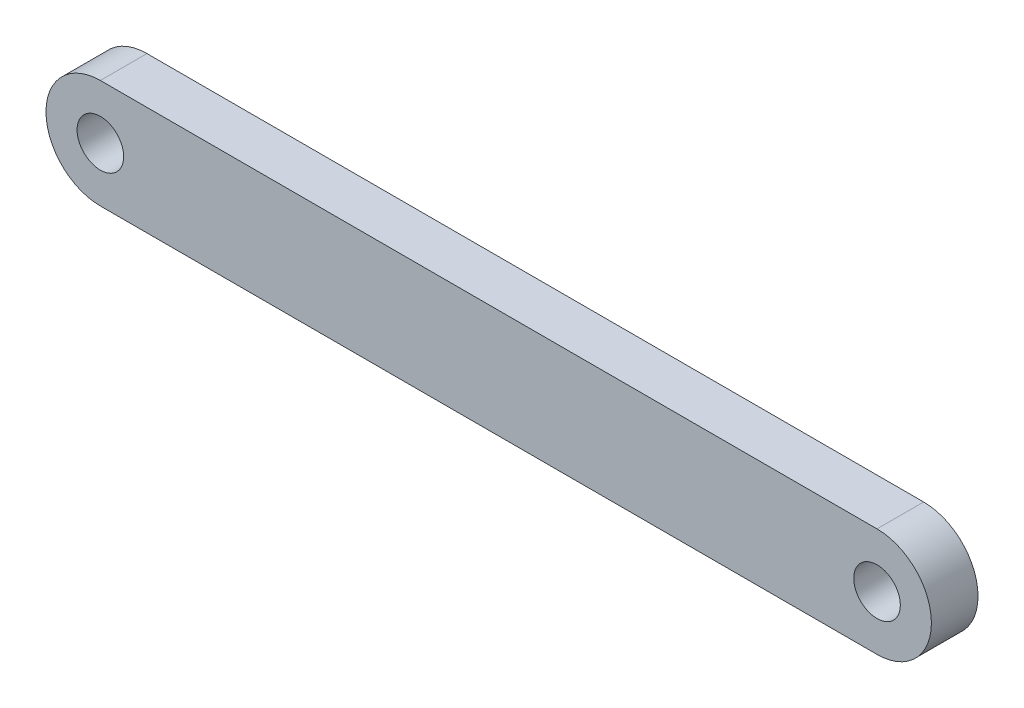
ISO-10303-21;
HEADER;
FILE_DESCRIPTION(('STEP AP214'),'2;1');
FILE_NAME('part.step','',(''),(''),'','','');
FILE_SCHEMA(('AUTOMOTIVE_DESIGN { 1 0 10303 214 1 1 1 1 }'));
ENDSEC;
DATA;
#1=APPLICATION_CONTEXT('core data for automotive mechanical design processes');
#2=APPLICATION_PROTOCOL_DEFINITION('international standard','automotive_design',2000,#1);
#3=PRODUCT_CONTEXT('',#1,'mechanical');
#4=PRODUCT('Part','Part','',(#3));
#5=PRODUCT_RELATED_PRODUCT_CATEGORY('part','',(#4));
#6=PRODUCT_DEFINITION_FORMATION('','',#4);
#7=PRODUCT_DEFINITION_CONTEXT('part definition',#1,'design');
#8=PRODUCT_DEFINITION('design','',#6,#7);
#9=PRODUCT_DEFINITION_SHAPE('','',#8);
#10=(LENGTH_UNIT() NAMED_UNIT(*) SI_UNIT(.MILLI.,.METRE.));
#11=(NAMED_UNIT(*) PLANE_ANGLE_UNIT() SI_UNIT($,.RADIAN.));
#12=(NAMED_UNIT(*) SI_UNIT($,.STERADIAN.) SOLID_ANGLE_UNIT());
#13=UNCERTAINTY_MEASURE_WITH_UNIT(LENGTH_MEASURE(1.E-05),#10,'distance_accuracy_value','');
#14=(GEOMETRIC_REPRESENTATION_CONTEXT(3) GLOBAL_UNCERTAINTY_ASSIGNED_CONTEXT((#13)) GLOBAL_UNIT_ASSIGNED_CONTEXT((#10,
#11,#12)) REPRESENTATION_CONTEXT('',''));
#15=CARTESIAN_POINT('',(0.,0.,0.));
#16=DIRECTION('',(0.,0.,1.));
#17=DIRECTION('',(1.,0.,0.));
#18=AXIS2_PLACEMENT_3D('',#15,#16,#17);
#19=CARTESIAN_POINT('',(50.75,31.9999999999999,3.));
#20=DIRECTION('',(0.,0.,-1.));
#21=DIRECTION('',(-1.,0.,0.));
#22=AXIS2_PLACEMENT_3D('',#19,#20,#21);
#23=PLANE('',#22);
#24=CARTESIAN_POINT('',(50.75,31.9999999999999,3.));
#25=DIRECTION('',(0.,0.,1.));
#26=DIRECTION('',(-1.,0.,0.));
#27=AXIS2_PLACEMENT_3D('',#24,#25,#26);
#28=CIRCLE('',#27,3.5);
#29=CARTESIAN_POINT('',(50.75,28.4999999999999,3.));
#30=VERTEX_POINT('',#29);
#31=CARTESIAN_POINT('',(50.75,35.5,3.));
#32=VERTEX_POINT('',#31);
#33=EDGE_CURVE('E89',#30,#32,#28,.T.);
#34=ORIENTED_EDGE('',*,*,#33,.T.);
#35=DIRECTION('',(-1.,0.,0.));
#36=VECTOR('',#35,1.);
#37=CARTESIAN_POINT('',(50.75,35.5,3.));
#38=LINE('',#37,#36);
#39=CARTESIAN_POINT('',(0.74999999999999,35.4999999999999,3.));
#40=VERTEX_POINT('',#39);
#41=EDGE_CURVE('E84',#32,#40,#38,.T.);
#42=ORIENTED_EDGE('',*,*,#41,.T.);
#43=CARTESIAN_POINT('',(0.749999999999994,31.9999999999999,3.));
#44=DIRECTION('',(0.,0.,1.));
#45=DIRECTION('',(-1.,0.,0.));
#46=AXIS2_PLACEMENT_3D('',#43,#44,#45);
#47=CIRCLE('',#46,3.49999999999999);
#48=CARTESIAN_POINT('',(0.749999999999994,28.5,3.));
#49=VERTEX_POINT('',#48);
#50=EDGE_CURVE('E87',#40,#49,#47,.T.);
#51=ORIENTED_EDGE('',*,*,#50,.T.);
#52=DIRECTION('',(1.,0.,0.));
#53=VECTOR('',#52,1.);
#54=CARTESIAN_POINT('',(50.75,28.4999999999999,3.));
#55=LINE('',#54,#53);
#56=EDGE_CURVE('E54',#49,#30,#55,.T.);
#57=ORIENTED_EDGE('',*,*,#56,.T.);
#58=EDGE_LOOP('',(#34,#42,#51,#57));
#59=FACE_BOUND('',#58,.T.);
#60=CARTESIAN_POINT('',(50.75,31.9999999999999,3.));
#61=DIRECTION('',(0.,0.,1.));
#62=DIRECTION('',(1.,0.,0.));
#63=AXIS2_PLACEMENT_3D('',#60,#61,#62);
#64=CIRCLE('',#63,1.5);
#65=CARTESIAN_POINT('',(52.25,31.9999999999999,3.));
#66=VERTEX_POINT('',#65);
#67=EDGE_CURVE('E104',#66,#66,#64,.T.);
#68=ORIENTED_EDGE('',*,*,#67,.F.);
#69=EDGE_LOOP('',(#68));
#70=FACE_BOUND('',#69,.T.);
#71=CARTESIAN_POINT('',(0.749999999999994,31.9999999999999,3.));
#72=DIRECTION('',(0.,0.,1.));
#73=DIRECTION('',(1.,0.,0.));
#74=AXIS2_PLACEMENT_3D('',#71,#72,#73);
#75=CIRCLE('',#74,1.5);
#76=CARTESIAN_POINT('',(2.24999999999999,31.9999999999999,3.));
#77=VERTEX_POINT('',#76);
#78=EDGE_CURVE('E119',#77,#77,#75,.T.);
#79=ORIENTED_EDGE('',*,*,#78,.F.);
#80=EDGE_LOOP('',(#79));
#81=FACE_BOUND('',#80,.T.);
#82=ADVANCED_FACE('F37',(#59,#70,#81),#23,.F.);
#83=CARTESIAN_POINT('',(50.75,31.9999999999999,0.));
#84=DIRECTION('',(0.,0.,-1.));
#85=DIRECTION('',(-1.,0.,0.));
#86=AXIS2_PLACEMENT_3D('',#83,#84,#85);
#87=PLANE('',#86);
#88=CARTESIAN_POINT('',(50.75,31.9999999999999,0.));
#89=DIRECTION('',(0.,0.,1.));
#90=DIRECTION('',(1.,0.,0.));
#91=AXIS2_PLACEMENT_3D('',#88,#89,#90);
#92=CIRCLE('',#91,1.5);
#93=CARTESIAN_POINT('',(52.25,31.9999999999999,0.));
#94=VERTEX_POINT('',#93);
#95=EDGE_CURVE('E116',#94,#94,#92,.T.);
#96=ORIENTED_EDGE('',*,*,#95,.T.);
#97=EDGE_LOOP('',(#96));
#98=FACE_BOUND('',#97,.T.);
#99=CARTESIAN_POINT('',(50.75,31.9999999999999,0.));
#100=DIRECTION('',(0.,0.,1.));
#101=DIRECTION('',(-1.,0.,0.));
#102=AXIS2_PLACEMENT_3D('',#99,#100,#101);
#103=CIRCLE('',#102,3.5);
#104=CARTESIAN_POINT('',(50.75,28.4999999999999,0.));
#105=VERTEX_POINT('',#104);
#106=CARTESIAN_POINT('',(50.75,35.5,0.));
#107=VERTEX_POINT('',#106);
#108=EDGE_CURVE('E101',#105,#107,#103,.T.);
#109=ORIENTED_EDGE('',*,*,#108,.F.);
#110=DIRECTION('',(1.,0.,0.));
#111=VECTOR('',#110,1.);
#112=CARTESIAN_POINT('',(50.75,28.4999999999999,0.));
#113=LINE('',#112,#111);
#114=CARTESIAN_POINT('',(0.749999999999994,28.5,0.));
#115=VERTEX_POINT('',#114);
#116=EDGE_CURVE('E77',#115,#105,#113,.T.);
#117=ORIENTED_EDGE('',*,*,#116,.F.);
#118=CARTESIAN_POINT('',(0.749999999999994,31.9999999999999,0.));
#119=DIRECTION('',(0.,0.,1.));
#120=DIRECTION('',(-1.,0.,0.));
#121=AXIS2_PLACEMENT_3D('',#118,#119,#120);
#122=CIRCLE('',#121,3.49999999999999);
#123=CARTESIAN_POINT('',(0.74999999999999,35.4999999999999,0.));
#124=VERTEX_POINT('',#123);
#125=EDGE_CURVE('E71',#124,#115,#122,.T.);
#126=ORIENTED_EDGE('',*,*,#125,.F.);
#127=DIRECTION('',(-1.,0.,0.));
#128=VECTOR('',#127,1.);
#129=CARTESIAN_POINT('',(50.75,35.5,0.));
#130=LINE('',#129,#128);
#131=EDGE_CURVE('E93',#107,#124,#130,.T.);
#132=ORIENTED_EDGE('',*,*,#131,.F.);
#133=EDGE_LOOP('',(#109,#117,#126,#132));
#134=FACE_BOUND('',#133,.T.);
#135=CARTESIAN_POINT('',(0.749999999999994,31.9999999999999,0.));
#136=DIRECTION('',(0.,0.,1.));
#137=DIRECTION('',(1.,0.,0.));
#138=AXIS2_PLACEMENT_3D('',#135,#136,#137);
#139=CIRCLE('',#138,1.5);
#140=CARTESIAN_POINT('',(2.24999999999999,31.9999999999999,0.));
#141=VERTEX_POINT('',#140);
#142=EDGE_CURVE('E122',#141,#141,#139,.T.);
#143=ORIENTED_EDGE('',*,*,#142,.T.);
#144=EDGE_LOOP('',(#143));
#145=FACE_BOUND('',#144,.T.);
#146=ADVANCED_FACE('F112',(#98,#134,#145),#87,.T.);
#147=CARTESIAN_POINT('',(50.75,31.9999999999999,3.));
#148=DIRECTION('',(0.,0.,-1.));
#149=DIRECTION('',(-1.,0.,0.));
#150=AXIS2_PLACEMENT_3D('',#147,#148,#149);
#151=CYLINDRICAL_SURFACE('',#150,3.5);
#152=ORIENTED_EDGE('',*,*,#108,.T.);
#153=DIRECTION('',(0.,0.,-1.));
#154=VECTOR('',#153,1.);
#155=CARTESIAN_POINT('',(50.75,35.5,3.));
#156=LINE('',#155,#154);
#157=EDGE_CURVE('E11',#32,#107,#156,.T.);
#158=ORIENTED_EDGE('',*,*,#157,.F.);
#159=ORIENTED_EDGE('',*,*,#33,.F.);
#160=DIRECTION('',(0.,0.,-1.));
#161=VECTOR('',#160,1.);
#162=CARTESIAN_POINT('',(50.75,28.4999999999999,3.));
#163=LINE('',#162,#161);
#164=EDGE_CURVE('E97',#30,#105,#163,.T.);
#165=ORIENTED_EDGE('',*,*,#164,.T.);
#166=EDGE_LOOP('',(#152,#158,#159,#165));
#167=FACE_BOUND('',#166,.T.);
#168=ADVANCED_FACE('F39',(#167),#151,.T.);
#169=CARTESIAN_POINT('',(50.75,35.5,3.));
#170=DIRECTION('',(0.,-1.,0.));
#171=DIRECTION('',(1.,0.,0.));
#172=AXIS2_PLACEMENT_3D('',#169,#170,#171);
#173=PLANE('',#172);
#174=ORIENTED_EDGE('',*,*,#131,.T.);
#175=DIRECTION('',(0.,0.,-1.));
#176=VECTOR('',#175,1.);
#177=CARTESIAN_POINT('',(0.74999999999999,35.4999999999999,3.));
#178=LINE('',#177,#176);
#179=EDGE_CURVE('E46',#40,#124,#178,.T.);
#180=ORIENTED_EDGE('',*,*,#179,.F.);
#181=ORIENTED_EDGE('',*,*,#41,.F.);
#182=ORIENTED_EDGE('',*,*,#157,.T.);
#183=EDGE_LOOP('',(#174,#180,#181,#182));
#184=FACE_BOUND('',#183,.T.);
#185=ADVANCED_FACE('F92',(#184),#173,.F.);
#186=CARTESIAN_POINT('',(0.749999999999994,31.9999999999999,3.));
#187=DIRECTION('',(0.,0.,-1.));
#188=DIRECTION('',(-1.,0.,0.));
#189=AXIS2_PLACEMENT_3D('',#186,#187,#188);
#190=CYLINDRICAL_SURFACE('',#189,3.49999999999999);
#191=ORIENTED_EDGE('',*,*,#125,.T.);
#192=DIRECTION('',(0.,0.,-1.));
#193=VECTOR('',#192,1.);
#194=CARTESIAN_POINT('',(0.749999999999994,28.5,3.));
#195=LINE('',#194,#193);
#196=EDGE_CURVE('E94',#49,#115,#195,.T.);
#197=ORIENTED_EDGE('',*,*,#196,.F.);
#198=ORIENTED_EDGE('',*,*,#50,.F.);
#199=ORIENTED_EDGE('',*,*,#179,.T.);
#200=EDGE_LOOP('',(#191,#197,#198,#199));
#201=FACE_BOUND('',#200,.T.);
#202=ADVANCED_FACE('F95',(#201),#190,.T.);
#203=CARTESIAN_POINT('',(50.75,28.4999999999999,3.));
#204=DIRECTION('',(0.,1.,0.));
#205=DIRECTION('',(0.,0.,1.));
#206=AXIS2_PLACEMENT_3D('',#203,#204,#205);
#207=PLANE('',#206);
#208=ORIENTED_EDGE('',*,*,#116,.T.);
#209=ORIENTED_EDGE('',*,*,#164,.F.);
#210=ORIENTED_EDGE('',*,*,#56,.F.);
#211=ORIENTED_EDGE('',*,*,#196,.T.);
#212=EDGE_LOOP('',(#208,#209,#210,#211));
#213=FACE_BOUND('',#212,.T.);
#214=ADVANCED_FACE('F109',(#213),#207,.F.);
#215=CARTESIAN_POINT('',(50.75,31.9999999999999,3.));
#216=DIRECTION('',(0.,0.,-1.));
#217=DIRECTION('',(-1.,0.,0.));
#218=AXIS2_PLACEMENT_3D('',#215,#216,#217);
#219=CYLINDRICAL_SURFACE('',#218,1.5);
#220=ORIENTED_EDGE('',*,*,#67,.T.);
#221=EDGE_LOOP('',(#220));
#222=FACE_BOUND('',#221,.T.);
#223=ORIENTED_EDGE('',*,*,#95,.F.);
#224=EDGE_LOOP('',(#223));
#225=FACE_BOUND('',#224,.T.);
#226=ADVANCED_FACE('F139',(#222,#225),#219,.F.);
#227=CARTESIAN_POINT('',(0.749999999999994,31.9999999999999,3.));
#228=DIRECTION('',(0.,0.,-1.));
#229=DIRECTION('',(-1.,0.,0.));
#230=AXIS2_PLACEMENT_3D('',#227,#228,#229);
#231=CYLINDRICAL_SURFACE('',#230,1.5);
#232=ORIENTED_EDGE('',*,*,#78,.T.);
#233=EDGE_LOOP('',(#232));
#234=FACE_BOUND('',#233,.T.);
#235=ORIENTED_EDGE('',*,*,#142,.F.);
#236=EDGE_LOOP('',(#235));
#237=FACE_BOUND('',#236,.T.);
#238=ADVANCED_FACE('F128',(#234,#237),#231,.F.);
#239=CLOSED_SHELL('',(#82,#146,#168,#185,#202,#214,#226,#238));
#240=MANIFOLD_SOLID_BREP('B2',#239);
#241=ADVANCED_BREP_SHAPE_REPRESENTATION('',(#18,#240),#14);
#242=SHAPE_DEFINITION_REPRESENTATION(#9,#241);
ENDSEC;
END-ISO-10303-21;
